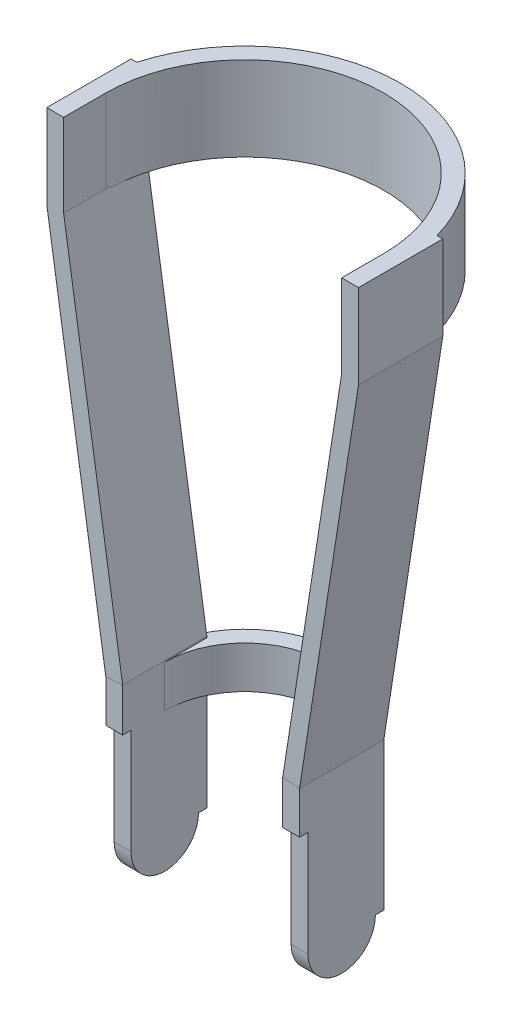
ISO-10303-21;
HEADER;
FILE_DESCRIPTION(('STEP AP214'),'2;1');
FILE_NAME('part.step','',(''),(''),'','','');
FILE_SCHEMA(('AUTOMOTIVE_DESIGN { 1 0 10303 214 1 1 1 1 }'));
ENDSEC;
DATA;
#1=APPLICATION_CONTEXT('core data for automotive mechanical design processes');
#2=APPLICATION_PROTOCOL_DEFINITION('international standard','automotive_design',2000,#1);
#3=PRODUCT_CONTEXT('',#1,'mechanical');
#4=PRODUCT('Part','Part','',(#3));
#5=PRODUCT_RELATED_PRODUCT_CATEGORY('part','',(#4));
#6=PRODUCT_DEFINITION_FORMATION('','',#4);
#7=PRODUCT_DEFINITION_CONTEXT('part definition',#1,'design');
#8=PRODUCT_DEFINITION('design','',#6,#7);
#9=PRODUCT_DEFINITION_SHAPE('','',#8);
#10=(LENGTH_UNIT() NAMED_UNIT(*) SI_UNIT(.MILLI.,.METRE.));
#11=(NAMED_UNIT(*) PLANE_ANGLE_UNIT() SI_UNIT($,.RADIAN.));
#12=(NAMED_UNIT(*) SI_UNIT($,.STERADIAN.) SOLID_ANGLE_UNIT());
#13=UNCERTAINTY_MEASURE_WITH_UNIT(LENGTH_MEASURE(1.E-05),#10,'distance_accuracy_value','');
#14=(GEOMETRIC_REPRESENTATION_CONTEXT(3) GLOBAL_UNCERTAINTY_ASSIGNED_CONTEXT((#13)) GLOBAL_UNIT_ASSIGNED_CONTEXT((#10,
#11,#12)) REPRESENTATION_CONTEXT('',''));
#15=CARTESIAN_POINT('',(0.,0.,0.));
#16=DIRECTION('',(0.,0.,1.));
#17=DIRECTION('',(1.,0.,0.));
#18=AXIS2_PLACEMENT_3D('',#15,#16,#17);
#19=CARTESIAN_POINT('',(0.,0.,0.));
#20=DIRECTION('',(0.,-1.,0.));
#21=DIRECTION('',(0.,0.,-1.));
#22=AXIS2_PLACEMENT_3D('',#19,#20,#21);
#23=PLANE('',#22);
#24=DIRECTION('',(1.,0.,0.));
#25=VECTOR('',#24,1.);
#26=CARTESIAN_POINT('',(38.,0.,-16.));
#27=LINE('',#26,#25);
#28=CARTESIAN_POINT('',(38.,0.,-16.));
#29=VERTEX_POINT('',#28);
#30=CARTESIAN_POINT('',(46.,0.,-16.));
#31=VERTEX_POINT('',#30);
#32=EDGE_CURVE('E52',#29,#31,#27,.T.);
#33=ORIENTED_EDGE('',*,*,#32,.F.);
#34=DIRECTION('',(0.,0.,1.));
#35=VECTOR('',#34,1.);
#36=CARTESIAN_POINT('',(38.,0.,20.));
#37=LINE('',#36,#35);
#38=CARTESIAN_POINT('',(38.,0.,-20.));
#39=VERTEX_POINT('',#38);
#40=EDGE_CURVE('E335',#39,#29,#37,.T.);
#41=ORIENTED_EDGE('',*,*,#40,.F.);
#42=DIRECTION('',(-1.,0.,0.));
#43=VECTOR('',#42,1.);
#44=CARTESIAN_POINT('',(38.,0.,-20.));
#45=LINE('',#44,#43);
#46=CARTESIAN_POINT('',(46.,0.,-20.));
#47=VERTEX_POINT('',#46);
#48=EDGE_CURVE('E488',#47,#39,#45,.T.);
#49=ORIENTED_EDGE('',*,*,#48,.F.);
#50=DIRECTION('',(0.,0.,-1.));
#51=VECTOR('',#50,1.);
#52=CARTESIAN_POINT('',(46.,0.,20.));
#53=LINE('',#52,#51);
#54=EDGE_CURVE('E485',#31,#47,#53,.T.);
#55=ORIENTED_EDGE('',*,*,#54,.F.);
#56=EDGE_LOOP('',(#33,#41,#49,#55));
#57=FACE_BOUND('',#56,.T.);
#58=ADVANCED_FACE('F41',(#57),#23,.T.);
#59=CARTESIAN_POINT('',(0.,290.,0.));
#60=DIRECTION('',(0.,1.,0.));
#61=DIRECTION('',(0.,0.,1.));
#62=AXIS2_PLACEMENT_3D('',#59,#60,#61);
#63=PLANE('',#62);
#64=DIRECTION('',(-1.,0.,0.));
#65=VECTOR('',#64,1.);
#66=CARTESIAN_POINT('',(66.,290.,-20.));
#67=LINE('',#66,#65);
#68=CARTESIAN_POINT('',(74.,290.,-20.));
#69=VERTEX_POINT('',#68);
#70=CARTESIAN_POINT('',(71.2460525222275,290.,-20.));
#71=VERTEX_POINT('',#70);
#72=EDGE_CURVE('E330',#69,#71,#67,.T.);
#73=ORIENTED_EDGE('',*,*,#72,.T.);
#74=CARTESIAN_POINT('',(0.,290.,0.));
#75=DIRECTION('',(0.,-1.,0.));
#76=DIRECTION('',(0.,0.,-1.));
#77=AXIS2_PLACEMENT_3D('',#74,#75,#76);
#78=CIRCLE('',#77,74.);
#79=CARTESIAN_POINT('',(-71.2460525222275,290.,-20.));
#80=VERTEX_POINT('',#79);
#81=EDGE_CURVE('E594',#80,#71,#78,.T.);
#82=ORIENTED_EDGE('',*,*,#81,.F.);
#83=DIRECTION('',(-1.,0.,0.));
#84=VECTOR('',#83,1.);
#85=CARTESIAN_POINT('',(-74.,290.,-20.));
#86=LINE('',#85,#84);
#87=CARTESIAN_POINT('',(-74.,290.,-20.));
#88=VERTEX_POINT('',#87);
#89=EDGE_CURVE('E726',#80,#88,#86,.T.);
#90=ORIENTED_EDGE('',*,*,#89,.T.);
#91=DIRECTION('',(0.,0.,-1.));
#92=VECTOR('',#91,1.);
#93=CARTESIAN_POINT('',(-74.,290.,0.));
#94=LINE('',#93,#92);
#95=CARTESIAN_POINT('',(-74.,290.,20.));
#96=VERTEX_POINT('',#95);
#97=EDGE_CURVE('E591',#96,#88,#94,.T.);
#98=ORIENTED_EDGE('',*,*,#97,.F.);
#99=DIRECTION('',(-1.,0.,0.));
#100=VECTOR('',#99,1.);
#101=CARTESIAN_POINT('',(-74.,290.,20.));
#102=LINE('',#101,#100);
#103=CARTESIAN_POINT('',(-66.,290.,20.));
#104=VERTEX_POINT('',#103);
#105=EDGE_CURVE('E576',#104,#96,#102,.T.);
#106=ORIENTED_EDGE('',*,*,#105,.F.);
#107=DIRECTION('',(0.,0.,1.));
#108=VECTOR('',#107,1.);
#109=CARTESIAN_POINT('',(-66.,290.,0.));
#110=LINE('',#109,#108);
#111=CARTESIAN_POINT('',(-66.,290.,0.));
#112=VERTEX_POINT('',#111);
#113=EDGE_CURVE('E560',#112,#104,#110,.T.);
#114=ORIENTED_EDGE('',*,*,#113,.F.);
#115=CARTESIAN_POINT('',(0.,290.,0.));
#116=DIRECTION('',(0.,1.,0.));
#117=DIRECTION('',(0.,0.,-1.));
#118=AXIS2_PLACEMENT_3D('',#115,#116,#117);
#119=CIRCLE('',#118,66.);
#120=CARTESIAN_POINT('',(66.,290.,0.));
#121=VERTEX_POINT('',#120);
#122=EDGE_CURVE('E551',#121,#112,#119,.T.);
#123=ORIENTED_EDGE('',*,*,#122,.F.);
#124=DIRECTION('',(0.,0.,-1.));
#125=VECTOR('',#124,1.);
#126=CARTESIAN_POINT('',(66.,290.,0.));
#127=LINE('',#126,#125);
#128=CARTESIAN_POINT('',(66.,290.,20.));
#129=VERTEX_POINT('',#128);
#130=EDGE_CURVE('E536',#129,#121,#127,.T.);
#131=ORIENTED_EDGE('',*,*,#130,.F.);
#132=DIRECTION('',(-1.,0.,0.));
#133=VECTOR('',#132,1.);
#134=CARTESIAN_POINT('',(74.,290.,20.));
#135=LINE('',#134,#133);
#136=CARTESIAN_POINT('',(74.,290.,20.));
#137=VERTEX_POINT('',#136);
#138=EDGE_CURVE('E535',#137,#129,#135,.T.);
#139=ORIENTED_EDGE('',*,*,#138,.F.);
#140=DIRECTION('',(0.,0.,1.));
#141=VECTOR('',#140,1.);
#142=CARTESIAN_POINT('',(74.,290.,0.));
#143=LINE('',#142,#141);
#144=EDGE_CURVE('E606',#69,#137,#143,.T.);
#145=ORIENTED_EDGE('',*,*,#144,.F.);
#146=EDGE_LOOP('',(#73,#82,#90,#98,#106,#114,#123,#131,#139,#145));
#147=FACE_BOUND('',#146,.T.);
#148=ADVANCED_FACE('F43',(#147),#63,.T.);
#149=CARTESIAN_POINT('',(0.,250.,0.));
#150=DIRECTION('',(0.,1.,0.));
#151=DIRECTION('',(0.,0.,1.));
#152=AXIS2_PLACEMENT_3D('',#149,#150,#151);
#153=PLANE('',#152);
#154=CARTESIAN_POINT('',(0.,250.,0.));
#155=DIRECTION('',(0.,-1.,0.));
#156=DIRECTION('',(0.,0.,-1.));
#157=AXIS2_PLACEMENT_3D('',#154,#155,#156);
#158=CIRCLE('',#157,74.);
#159=CARTESIAN_POINT('',(-71.2460525222275,250.,-20.));
#160=VERTEX_POINT('',#159);
#161=CARTESIAN_POINT('',(71.2460525222275,250.,-20.));
#162=VERTEX_POINT('',#161);
#163=EDGE_CURVE('E598',#160,#162,#158,.T.);
#164=ORIENTED_EDGE('',*,*,#163,.T.);
#165=DIRECTION('',(-1.,0.,0.));
#166=VECTOR('',#165,1.);
#167=CARTESIAN_POINT('',(0.,250.,-20.));
#168=LINE('',#167,#166);
#169=CARTESIAN_POINT('',(65.9037884183213,250.,-20.));
#170=VERTEX_POINT('',#169);
#171=EDGE_CURVE('E353',#162,#170,#168,.T.);
#172=ORIENTED_EDGE('',*,*,#171,.T.);
#173=DIRECTION('',(0.,0.,1.));
#174=VECTOR('',#173,1.);
#175=CARTESIAN_POINT('',(65.9037884183213,250.,0.));
#176=LINE('',#175,#174);
#177=CARTESIAN_POINT('',(65.9037884183213,250.,-3.56239696175823));
#178=VERTEX_POINT('',#177);
#179=EDGE_CURVE('E362',#170,#178,#176,.T.);
#180=ORIENTED_EDGE('',*,*,#179,.T.);
#181=CARTESIAN_POINT('',(0.,250.,0.));
#182=DIRECTION('',(0.,1.,0.));
#183=DIRECTION('',(0.,0.,-1.));
#184=AXIS2_PLACEMENT_3D('',#181,#182,#183);
#185=CIRCLE('',#184,66.);
#186=CARTESIAN_POINT('',(-65.9037884183213,250.,-3.56239696175823));
#187=VERTEX_POINT('',#186);
#188=EDGE_CURVE('E508',#178,#187,#185,.T.);
#189=ORIENTED_EDGE('',*,*,#188,.T.);
#190=DIRECTION('',(0.,0.,-1.));
#191=VECTOR('',#190,1.);
#192=CARTESIAN_POINT('',(-65.9037884183213,250.,0.));
#193=LINE('',#192,#191);
#194=CARTESIAN_POINT('',(-65.9037884183213,250.,-20.));
#195=VERTEX_POINT('',#194);
#196=EDGE_CURVE('E649',#187,#195,#193,.T.);
#197=ORIENTED_EDGE('',*,*,#196,.T.);
#198=DIRECTION('',(-1.,0.,0.));
#199=VECTOR('',#198,1.);
#200=CARTESIAN_POINT('',(0.,250.,-20.));
#201=LINE('',#200,#199);
#202=EDGE_CURVE('E651',#195,#160,#201,.T.);
#203=ORIENTED_EDGE('',*,*,#202,.T.);
#204=EDGE_LOOP('',(#164,#172,#180,#189,#197,#203));
#205=FACE_BOUND('',#204,.T.);
#206=ADVANCED_FACE('F791',(#205),#153,.F.);
#207=CARTESIAN_POINT('',(-74.,250.,0.));
#208=DIRECTION('',(1.,0.,0.));
#209=DIRECTION('',(0.,0.,-1.));
#210=AXIS2_PLACEMENT_3D('',#207,#208,#209);
#211=PLANE('',#210);
#212=ORIENTED_EDGE('',*,*,#97,.T.);
#213=DIRECTION('',(0.,1.,0.));
#214=VECTOR('',#213,1.);
#215=CARTESIAN_POINT('',(-74.,250.,-20.));
#216=LINE('',#215,#214);
#217=CARTESIAN_POINT('',(-74.,250.,-20.));
#218=VERTEX_POINT('',#217);
#219=EDGE_CURVE('E730',#218,#88,#216,.T.);
#220=ORIENTED_EDGE('',*,*,#219,.F.);
#221=DIRECTION('',(0.,0.,-1.));
#222=VECTOR('',#221,1.);
#223=CARTESIAN_POINT('',(-74.,250.,0.));
#224=LINE('',#223,#222);
#225=CARTESIAN_POINT('',(-74.,250.,20.));
#226=VERTEX_POINT('',#225);
#227=EDGE_CURVE('E584',#226,#218,#224,.T.);
#228=ORIENTED_EDGE('',*,*,#227,.F.);
#229=DIRECTION('',(0.,1.,0.));
#230=VECTOR('',#229,1.);
#231=CARTESIAN_POINT('',(-74.,250.,20.));
#232=LINE('',#231,#230);
#233=EDGE_CURVE('E587',#226,#96,#232,.T.);
#234=ORIENTED_EDGE('',*,*,#233,.T.);
#235=EDGE_LOOP('',(#212,#220,#228,#234));
#236=FACE_BOUND('',#235,.T.);
#237=ADVANCED_FACE('F807',(#236),#211,.F.);
#238=CARTESIAN_POINT('',(-74.,250.,20.));
#239=DIRECTION('',(0.,0.,-1.));
#240=DIRECTION('',(-1.,0.,0.));
#241=AXIS2_PLACEMENT_3D('',#238,#239,#240);
#242=PLANE('',#241);
#243=DIRECTION('',(-0.153707006281871,0.988116468954882,0.));
#244=VECTOR('',#243,1.);
#245=CARTESIAN_POINT('',(-37.9751224745357,70.4585760756643,20.));
#246=LINE('',#245,#244);
#247=CARTESIAN_POINT('',(-38.,70.6185030250775,20.));
#248=VERTEX_POINT('',#247);
#249=CARTESIAN_POINT('',(-66.,250.618503025078,20.));
#250=VERTEX_POINT('',#249);
#251=EDGE_CURVE('E716',#248,#250,#246,.T.);
#252=ORIENTED_EDGE('',*,*,#251,.T.);
#253=DIRECTION('',(0.,1.,0.));
#254=VECTOR('',#253,1.);
#255=CARTESIAN_POINT('',(-66.,250.,20.));
#256=LINE('',#255,#254);
#257=EDGE_CURVE('E572',#250,#104,#256,.T.);
#258=ORIENTED_EDGE('',*,*,#257,.T.);
#259=ORIENTED_EDGE('',*,*,#105,.T.);
#260=ORIENTED_EDGE('',*,*,#233,.F.);
#261=DIRECTION('',(-0.153707006281871,0.988116468954882,0.));
#262=VECTOR('',#261,1.);
#263=CARTESIAN_POINT('',(-45.8800542261748,69.2289200254093,20.));
#264=LINE('',#263,#262);
#265=CARTESIAN_POINT('',(-46.,70.,20.));
#266=VERTEX_POINT('',#265);
#267=EDGE_CURVE('E577',#266,#226,#264,.T.);
#268=ORIENTED_EDGE('',*,*,#267,.F.);
#269=DIRECTION('',(-0.997024691006919,-0.0770828484330906,0.));
#270=VECTOR('',#269,1.);
#271=CARTESIAN_POINT('',(-47.5370700628187,69.8811646895488,20.));
#272=LINE('',#271,#270);
#273=EDGE_CURVE('E696',#248,#266,#272,.T.);
#274=ORIENTED_EDGE('',*,*,#273,.F.);
#275=EDGE_LOOP('',(#252,#258,#259,#260,#268,#274));
#276=FACE_BOUND('',#275,.T.);
#277=ADVANCED_FACE('F811',(#276),#242,.F.);
#278=CARTESIAN_POINT('',(-66.,250.,0.));
#279=DIRECTION('',(-1.,0.,0.));
#280=DIRECTION('',(0.,0.,1.));
#281=AXIS2_PLACEMENT_3D('',#278,#279,#280);
#282=PLANE('',#281);
#283=ORIENTED_EDGE('',*,*,#257,.F.);
#284=DIRECTION('',(0.,0.,1.));
#285=VECTOR('',#284,1.);
#286=CARTESIAN_POINT('',(-66.,250.618503025078,20.));
#287=LINE('',#286,#285);
#288=CARTESIAN_POINT('',(-66.,250.618503025078,0.));
#289=VERTEX_POINT('',#288);
#290=EDGE_CURVE('E720',#289,#250,#287,.T.);
#291=ORIENTED_EDGE('',*,*,#290,.F.);
#292=DIRECTION('',(0.,1.,0.));
#293=VECTOR('',#292,1.);
#294=CARTESIAN_POINT('',(-66.,250.,0.));
#295=LINE('',#294,#293);
#296=EDGE_CURVE('E555',#289,#112,#295,.T.);
#297=ORIENTED_EDGE('',*,*,#296,.T.);
#298=ORIENTED_EDGE('',*,*,#113,.T.);
#299=EDGE_LOOP('',(#283,#291,#297,#298));
#300=FACE_BOUND('',#299,.T.);
#301=ADVANCED_FACE('F1027',(#300),#282,.F.);
#302=CARTESIAN_POINT('',(0.,250.,0.));
#303=DIRECTION('',(0.,1.,0.));
#304=DIRECTION('',(0.,0.,1.));
#305=AXIS2_PLACEMENT_3D('',#302,#303,#304);
#306=CYLINDRICAL_SURFACE('',#305,66.);
#307=ORIENTED_EDGE('',*,*,#188,.F.);
#308=CARTESIAN_POINT('',(0.,-173.667211260637,0.));
#309=DIRECTION('',(-0.988116468954882,0.153707006281871,0.));
#310=DIRECTION('',(0.153707006281871,0.988116468954882,0.));
#311=AXIS2_PLACEMENT_3D('',#308,#309,#310);
#312=ELLIPSE('',#311,429.388364242604,66.);
#313=CARTESIAN_POINT('',(66.,250.618503025078,0.));
#314=VERTEX_POINT('',#313);
#315=EDGE_CURVE('E358',#178,#314,#312,.F.);
#316=ORIENTED_EDGE('',*,*,#315,.T.);
#317=DIRECTION('',(0.,1.,0.));
#318=VECTOR('',#317,1.);
#319=CARTESIAN_POINT('',(66.,250.,0.));
#320=LINE('',#319,#318);
#321=EDGE_CURVE('E537',#314,#121,#320,.T.);
#322=ORIENTED_EDGE('',*,*,#321,.T.);
#323=ORIENTED_EDGE('',*,*,#122,.T.);
#324=ORIENTED_EDGE('',*,*,#296,.F.);
#325=CARTESIAN_POINT('',(0.,-173.667211260637,0.));
#326=DIRECTION('',(0.988116468954882,0.153707006281871,0.));
#327=DIRECTION('',(-0.153707006281871,0.988116468954882,0.));
#328=AXIS2_PLACEMENT_3D('',#325,#326,#327);
#329=ELLIPSE('',#328,429.388364242604,66.);
#330=EDGE_CURVE('E568',#289,#187,#329,.F.);
#331=ORIENTED_EDGE('',*,*,#330,.T.);
#332=EDGE_LOOP('',(#307,#316,#322,#323,#324,#331));
#333=FACE_BOUND('',#332,.T.);
#334=ADVANCED_FACE('F636',(#333),#306,.F.);
#335=CARTESIAN_POINT('',(66.,250.,0.));
#336=DIRECTION('',(1.,0.,0.));
#337=DIRECTION('',(0.,0.,-1.));
#338=AXIS2_PLACEMENT_3D('',#335,#336,#337);
#339=PLANE('',#338);
#340=ORIENTED_EDGE('',*,*,#321,.F.);
#341=DIRECTION('',(0.,0.,-1.));
#342=VECTOR('',#341,1.);
#343=CARTESIAN_POINT('',(66.,250.618503025078,20.));
#344=LINE('',#343,#342);
#345=CARTESIAN_POINT('',(66.,250.618503025078,20.));
#346=VERTEX_POINT('',#345);
#347=EDGE_CURVE('E469',#346,#314,#344,.T.);
#348=ORIENTED_EDGE('',*,*,#347,.F.);
#349=DIRECTION('',(0.,1.,0.));
#350=VECTOR('',#349,1.);
#351=CARTESIAN_POINT('',(66.,250.,20.));
#352=LINE('',#351,#350);
#353=EDGE_CURVE('E532',#346,#129,#352,.T.);
#354=ORIENTED_EDGE('',*,*,#353,.T.);
#355=ORIENTED_EDGE('',*,*,#130,.T.);
#356=EDGE_LOOP('',(#340,#348,#354,#355));
#357=FACE_BOUND('',#356,.T.);
#358=ADVANCED_FACE('F630',(#357),#339,.F.);
#359=CARTESIAN_POINT('',(74.,250.,20.));
#360=DIRECTION('',(0.,0.,-1.));
#361=DIRECTION('',(-1.,0.,0.));
#362=AXIS2_PLACEMENT_3D('',#359,#360,#361);
#363=PLANE('',#362);
#364=DIRECTION('',(0.153707006281871,0.988116468954882,0.));
#365=VECTOR('',#364,1.);
#366=CARTESIAN_POINT('',(45.8800542261748,69.2289200254093,20.));
#367=LINE('',#366,#365);
#368=CARTESIAN_POINT('',(46.,70.,20.));
#369=VERTEX_POINT('',#368);
#370=CARTESIAN_POINT('',(74.,250.,20.));
#371=VERTEX_POINT('',#370);
#372=EDGE_CURVE('E432',#369,#371,#367,.T.);
#373=ORIENTED_EDGE('',*,*,#372,.T.);
#374=DIRECTION('',(0.,1.,0.));
#375=VECTOR('',#374,1.);
#376=CARTESIAN_POINT('',(74.,250.,20.));
#377=LINE('',#376,#375);
#378=EDGE_CURVE('E609',#371,#137,#377,.T.);
#379=ORIENTED_EDGE('',*,*,#378,.T.);
#380=ORIENTED_EDGE('',*,*,#138,.T.);
#381=ORIENTED_EDGE('',*,*,#353,.F.);
#382=DIRECTION('',(0.153707006281871,0.988116468954882,0.));
#383=VECTOR('',#382,1.);
#384=CARTESIAN_POINT('',(37.9751224745357,70.4585760756643,20.));
#385=LINE('',#384,#383);
#386=CARTESIAN_POINT('',(38.,70.6185030250775,20.));
#387=VERTEX_POINT('',#386);
#388=EDGE_CURVE('E460',#387,#346,#385,.T.);
#389=ORIENTED_EDGE('',*,*,#388,.F.);
#390=DIRECTION('',(-0.997024691006919,0.0770828484330906,0.));
#391=VECTOR('',#390,1.);
#392=CARTESIAN_POINT('',(39.5846041869992,70.4959927146763,20.));
#393=LINE('',#392,#391);
#394=EDGE_CURVE('E466',#369,#387,#393,.T.);
#395=ORIENTED_EDGE('',*,*,#394,.F.);
#396=EDGE_LOOP('',(#373,#379,#380,#381,#389,#395));
#397=FACE_BOUND('',#396,.T.);
#398=ADVANCED_FACE('F622',(#397),#363,.F.);
#399=CARTESIAN_POINT('',(74.,250.,0.));
#400=DIRECTION('',(-1.,0.,0.));
#401=DIRECTION('',(0.,0.,1.));
#402=AXIS2_PLACEMENT_3D('',#399,#400,#401);
#403=PLANE('',#402);
#404=ORIENTED_EDGE('',*,*,#144,.T.);
#405=ORIENTED_EDGE('',*,*,#378,.F.);
#406=DIRECTION('',(0.,0.,1.));
#407=VECTOR('',#406,1.);
#408=CARTESIAN_POINT('',(74.,250.,0.));
#409=LINE('',#408,#407);
#410=CARTESIAN_POINT('',(74.,250.,-20.));
#411=VERTEX_POINT('',#410);
#412=EDGE_CURVE('E599',#411,#371,#409,.T.);
#413=ORIENTED_EDGE('',*,*,#412,.F.);
#414=DIRECTION('',(0.,1.,0.));
#415=VECTOR('',#414,1.);
#416=CARTESIAN_POINT('',(74.,250.,-20.));
#417=LINE('',#416,#415);
#418=EDGE_CURVE('E472',#411,#69,#417,.T.);
#419=ORIENTED_EDGE('',*,*,#418,.T.);
#420=EDGE_LOOP('',(#404,#405,#413,#419));
#421=FACE_BOUND('',#420,.T.);
#422=ADVANCED_FACE('F767',(#421),#403,.F.);
#423=CARTESIAN_POINT('',(0.,250.,0.));
#424=DIRECTION('',(0.,1.,0.));
#425=DIRECTION('',(0.,0.,1.));
#426=AXIS2_PLACEMENT_3D('',#423,#424,#425);
#427=CYLINDRICAL_SURFACE('',#426,74.);
#428=ORIENTED_EDGE('',*,*,#81,.T.);
#429=DIRECTION('',(0.,1.,0.));
#430=VECTOR('',#429,1.);
#431=CARTESIAN_POINT('',(71.2460525222275,250.,-20.));
#432=LINE('',#431,#430);
#433=CARTESIAN_POINT('',(71.2460525222275,250.212915605738,-20.));
#434=VERTEX_POINT('',#433);
#435=EDGE_CURVE('E519',#71,#434,#432,.F.);
#436=ORIENTED_EDGE('',*,*,#435,.T.);
#437=DIRECTION('',(0.,1.,0.));
#438=VECTOR('',#437,1.);
#439=CARTESIAN_POINT('',(71.2460525222275,250.,-20.));
#440=LINE('',#439,#438);
#441=EDGE_CURVE('E525',#434,#162,#440,.F.);
#442=ORIENTED_EDGE('',*,*,#441,.T.);
#443=ORIENTED_EDGE('',*,*,#163,.F.);
#444=DIRECTION('',(0.,1.,0.));
#445=VECTOR('',#444,1.);
#446=CARTESIAN_POINT('',(-71.2460525222275,250.,-20.));
#447=LINE('',#446,#445);
#448=CARTESIAN_POINT('',(-71.2460525222275,250.212915605738,-20.));
#449=VERTEX_POINT('',#448);
#450=EDGE_CURVE('E818',#160,#449,#447,.T.);
#451=ORIENTED_EDGE('',*,*,#450,.T.);
#452=DIRECTION('',(0.,1.,0.));
#453=VECTOR('',#452,1.);
#454=CARTESIAN_POINT('',(-71.2460525222275,250.,-20.));
#455=LINE('',#454,#453);
#456=EDGE_CURVE('E566',#449,#80,#455,.T.);
#457=ORIENTED_EDGE('',*,*,#456,.T.);
#458=EDGE_LOOP('',(#428,#436,#442,#443,#451,#457));
#459=FACE_BOUND('',#458,.T.);
#460=ADVANCED_FACE('F785',(#459),#427,.T.);
#461=CARTESIAN_POINT('',(-37.9751224745357,70.4585760756643,20.));
#462=DIRECTION('',(0.988116468954882,0.153707006281871,0.));
#463=DIRECTION('',(-0.153707006281871,0.988116468954882,0.));
#464=AXIS2_PLACEMENT_3D('',#461,#462,#463);
#465=PLANE('',#464);
#466=ORIENTED_EDGE('',*,*,#196,.F.);
#467=ORIENTED_EDGE('',*,*,#330,.F.);
#468=ORIENTED_EDGE('',*,*,#290,.T.);
#469=ORIENTED_EDGE('',*,*,#251,.F.);
#470=DIRECTION('',(0.,0.,1.));
#471=VECTOR('',#470,1.);
#472=CARTESIAN_POINT('',(-38.,70.6185030250775,20.));
#473=LINE('',#472,#471);
#474=CARTESIAN_POINT('',(-38.,70.6185030250775,-20.));
#475=VERTEX_POINT('',#474);
#476=EDGE_CURVE('E692',#475,#248,#473,.T.);
#477=ORIENTED_EDGE('',*,*,#476,.F.);
#478=DIRECTION('',(-0.153707006281871,0.988116468954882,0.));
#479=VECTOR('',#478,1.);
#480=CARTESIAN_POINT('',(-37.9751224745357,70.4585760756643,-20.));
#481=LINE('',#480,#479);
#482=EDGE_CURVE('E712',#475,#195,#481,.T.);
#483=ORIENTED_EDGE('',*,*,#482,.T.);
#484=EDGE_LOOP('',(#466,#467,#468,#469,#477,#483));
#485=FACE_BOUND('',#484,.T.);
#486=ADVANCED_FACE('F792',(#485),#465,.T.);
#487=CARTESIAN_POINT('',(-74.,250.,-20.));
#488=DIRECTION('',(0.,0.,-1.));
#489=DIRECTION('',(-1.,0.,0.));
#490=AXIS2_PLACEMENT_3D('',#487,#488,#489);
#491=PLANE('',#490);
#492=ORIENTED_EDGE('',*,*,#456,.F.);
#493=DIRECTION('',(0.997024691006918,0.0770828484330906,0.));
#494=VECTOR('',#493,1.);
#495=CARTESIAN_POINT('',(-59.9400271130874,251.087016970383,-20.));
#496=LINE('',#495,#494);
#497=EDGE_CURVE('E723',#218,#449,#496,.T.);
#498=ORIENTED_EDGE('',*,*,#497,.F.);
#499=ORIENTED_EDGE('',*,*,#219,.T.);
#500=ORIENTED_EDGE('',*,*,#89,.F.);
#501=EDGE_LOOP('',(#492,#498,#499,#500));
#502=FACE_BOUND('',#501,.T.);
#503=ADVANCED_FACE('F801',(#502),#491,.T.);
#504=CARTESIAN_POINT('',(-45.8800542261748,69.2289200254093,-20.));
#505=DIRECTION('',(0.,0.,-1.));
#506=DIRECTION('',(-1.,0.,0.));
#507=AXIS2_PLACEMENT_3D('',#504,#505,#506);
#508=PLANE('',#507);
#509=ORIENTED_EDGE('',*,*,#202,.F.);
#510=ORIENTED_EDGE('',*,*,#482,.F.);
#511=DIRECTION('',(0.997024691006919,0.0770828484330906,0.));
#512=VECTOR('',#511,1.);
#513=CARTESIAN_POINT('',(-47.5370700628187,69.8811646895488,-20.));
#514=LINE('',#513,#512);
#515=CARTESIAN_POINT('',(-46.,70.,-20.));
#516=VERTEX_POINT('',#515);
#517=EDGE_CURVE('E703',#516,#475,#514,.T.);
#518=ORIENTED_EDGE('',*,*,#517,.F.);
#519=DIRECTION('',(-0.153707006281871,0.988116468954882,0.));
#520=VECTOR('',#519,1.);
#521=CARTESIAN_POINT('',(-45.8800542261748,69.2289200254093,-20.));
#522=LINE('',#521,#520);
#523=EDGE_CURVE('E709',#516,#218,#522,.T.);
#524=ORIENTED_EDGE('',*,*,#523,.T.);
#525=ORIENTED_EDGE('',*,*,#497,.T.);
#526=ORIENTED_EDGE('',*,*,#450,.F.);
#527=EDGE_LOOP('',(#509,#510,#518,#524,#525,#526));
#528=FACE_BOUND('',#527,.T.);
#529=ADVANCED_FACE('F833',(#528),#508,.T.);
#530=CARTESIAN_POINT('',(0.,0.,0.));
#531=DIRECTION('',(0.,-1.,0.));
#532=DIRECTION('',(0.,0.,-1.));
#533=AXIS2_PLACEMENT_3D('',#530,#531,#532);
#534=PLANE('',#533);
#535=DIRECTION('',(-1.,0.,0.));
#536=VECTOR('',#535,1.);
#537=CARTESIAN_POINT('',(-38.,0.,-16.));
#538=LINE('',#537,#536);
#539=CARTESIAN_POINT('',(-46.,0.,-16.));
#540=VERTEX_POINT('',#539);
#541=CARTESIAN_POINT('',(-38.,0.,-16.));
#542=VERTEX_POINT('',#541);
#543=EDGE_CURVE('E319',#540,#542,#538,.F.);
#544=ORIENTED_EDGE('',*,*,#543,.F.);
#545=DIRECTION('',(0.,0.,1.));
#546=VECTOR('',#545,1.);
#547=CARTESIAN_POINT('',(-46.,0.,20.));
#548=LINE('',#547,#546);
#549=CARTESIAN_POINT('',(-46.,0.,-20.));
#550=VERTEX_POINT('',#549);
#551=EDGE_CURVE('E662',#550,#540,#548,.T.);
#552=ORIENTED_EDGE('',*,*,#551,.F.);
#553=DIRECTION('',(-1.,0.,0.));
#554=VECTOR('',#553,1.);
#555=CARTESIAN_POINT('',(-46.,0.,-20.));
#556=LINE('',#555,#554);
#557=CARTESIAN_POINT('',(-38.,0.,-20.));
#558=VERTEX_POINT('',#557);
#559=EDGE_CURVE('E658',#558,#550,#556,.T.);
#560=ORIENTED_EDGE('',*,*,#559,.F.);
#561=DIRECTION('',(0.,0.,-1.));
#562=VECTOR('',#561,1.);
#563=CARTESIAN_POINT('',(-38.,0.,20.));
#564=LINE('',#563,#562);
#565=EDGE_CURVE('E655',#542,#558,#564,.T.);
#566=ORIENTED_EDGE('',*,*,#565,.F.);
#567=EDGE_LOOP('',(#544,#552,#560,#566));
#568=FACE_BOUND('',#567,.T.);
#569=ADVANCED_FACE('F855',(#568),#534,.T.);
#570=CARTESIAN_POINT('',(-45.8800542261748,69.2289200254093,20.));
#571=DIRECTION('',(-0.988116468954882,-0.153707006281871,0.));
#572=DIRECTION('',(0.153707006281871,-0.988116468954882,0.));
#573=AXIS2_PLACEMENT_3D('',#570,#571,#572);
#574=PLANE('',#573);
#575=DIRECTION('',(0.,0.,-1.));
#576=VECTOR('',#575,1.);
#577=CARTESIAN_POINT('',(-46.,70.,20.));
#578=LINE('',#577,#576);
#579=EDGE_CURVE('E700',#266,#516,#578,.T.);
#580=ORIENTED_EDGE('',*,*,#579,.F.);
#581=ORIENTED_EDGE('',*,*,#267,.T.);
#582=ORIENTED_EDGE('',*,*,#227,.T.);
#583=ORIENTED_EDGE('',*,*,#523,.F.);
#584=EDGE_LOOP('',(#580,#581,#582,#583));
#585=FACE_BOUND('',#584,.T.);
#586=ADVANCED_FACE('F837',(#585),#574,.T.);
#587=CARTESIAN_POINT('',(-38.,0.,20.));
#588=DIRECTION('',(1.,0.,0.));
#589=DIRECTION('',(0.,1.,0.));
#590=AXIS2_PLACEMENT_3D('',#587,#588,#589);
#591=PLANE('',#590);
#592=DIRECTION('',(0.,1.,0.));
#593=VECTOR('',#592,1.);
#594=CARTESIAN_POINT('',(-38.,0.,16.));
#595=LINE('',#594,#593);
#596=CARTESIAN_POINT('',(-38.,0.,16.));
#597=VERTEX_POINT('',#596);
#598=CARTESIAN_POINT('',(-38.,50.,16.));
#599=VERTEX_POINT('',#598);
#600=EDGE_CURVE('E285',#597,#599,#595,.T.);
#601=ORIENTED_EDGE('',*,*,#600,.F.);
#602=CARTESIAN_POINT('',(-38.,0.,0.));
#603=DIRECTION('',(-1.,0.,0.));
#604=DIRECTION('',(0.,-1.,0.));
#605=AXIS2_PLACEMENT_3D('',#602,#603,#604);
#606=CIRCLE('',#605,16.);
#607=EDGE_CURVE('E315',#542,#597,#606,.T.);
#608=ORIENTED_EDGE('',*,*,#607,.F.);
#609=ORIENTED_EDGE('',*,*,#565,.T.);
#610=DIRECTION('',(0.,1.,0.));
#611=VECTOR('',#610,1.);
#612=CARTESIAN_POINT('',(-38.,0.,-20.));
#613=LINE('',#612,#611);
#614=CARTESIAN_POINT('',(-38.,50.,-20.));
#615=VERTEX_POINT('',#614);
#616=EDGE_CURVE('E667',#558,#615,#613,.T.);
#617=ORIENTED_EDGE('',*,*,#616,.T.);
#618=DIRECTION('',(0.,0.,1.));
#619=VECTOR('',#618,1.);
#620=CARTESIAN_POINT('',(-38.,50.,20.));
#621=LINE('',#620,#619);
#622=CARTESIAN_POINT('',(-38.,50.,0.));
#623=VERTEX_POINT('',#622);
#624=EDGE_CURVE('E374',#615,#623,#621,.T.);
#625=ORIENTED_EDGE('',*,*,#624,.T.);
#626=DIRECTION('',(0.,1.,0.));
#627=VECTOR('',#626,1.);
#628=CARTESIAN_POINT('',(-38.,50.,0.));
#629=LINE('',#628,#627);
#630=CARTESIAN_POINT('',(-38.,70.,0.));
#631=VERTEX_POINT('',#630);
#632=EDGE_CURVE('E387',#623,#631,#629,.T.);
#633=ORIENTED_EDGE('',*,*,#632,.T.);
#634=DIRECTION('',(0.,0.,1.));
#635=VECTOR('',#634,1.);
#636=CARTESIAN_POINT('',(-38.,70.,20.));
#637=LINE('',#636,#635);
#638=CARTESIAN_POINT('',(-38.,70.,-20.));
#639=VERTEX_POINT('',#638);
#640=EDGE_CURVE('E738',#639,#631,#637,.T.);
#641=ORIENTED_EDGE('',*,*,#640,.F.);
#642=DIRECTION('',(0.,1.,0.));
#643=VECTOR('',#642,1.);
#644=CARTESIAN_POINT('',(-38.,50.,-20.));
#645=LINE('',#644,#643);
#646=EDGE_CURVE('E685',#639,#475,#645,.T.);
#647=ORIENTED_EDGE('',*,*,#646,.T.);
#648=ORIENTED_EDGE('',*,*,#476,.T.);
#649=DIRECTION('',(0.,1.,0.));
#650=VECTOR('',#649,1.);
#651=CARTESIAN_POINT('',(-38.,0.,20.));
#652=LINE('',#651,#650);
#653=CARTESIAN_POINT('',(-38.,50.,20.));
#654=VERTEX_POINT('',#653);
#655=EDGE_CURVE('E45',#654,#248,#652,.T.);
#656=ORIENTED_EDGE('',*,*,#655,.F.);
#657=DIRECTION('',(0.,0.,1.));
#658=VECTOR('',#657,1.);
#659=CARTESIAN_POINT('',(-38.,50.,20.));
#660=LINE('',#659,#658);
#661=EDGE_CURVE('E312',#599,#654,#660,.T.);
#662=ORIENTED_EDGE('',*,*,#661,.F.);
#663=EDGE_LOOP('',(#601,#608,#609,#617,#625,#633,#641,#647,#648,#656,#662));
#664=FACE_BOUND('',#663,.T.);
#665=ADVANCED_FACE('F859',(#664),#591,.T.);
#666=CARTESIAN_POINT('',(-46.,0.,-20.));
#667=DIRECTION('',(0.,0.,-1.));
#668=DIRECTION('',(-1.,0.,0.));
#669=AXIS2_PLACEMENT_3D('',#666,#667,#668);
#670=PLANE('',#669);
#671=DIRECTION('',(0.,1.,0.));
#672=VECTOR('',#671,1.);
#673=CARTESIAN_POINT('',(-46.,0.,-20.));
#674=LINE('',#673,#672);
#675=CARTESIAN_POINT('',(-46.,50.,-20.));
#676=VERTEX_POINT('',#675);
#677=EDGE_CURVE('E677',#550,#676,#674,.T.);
#678=ORIENTED_EDGE('',*,*,#677,.T.);
#679=DIRECTION('',(-1.,0.,0.));
#680=VECTOR('',#679,1.);
#681=CARTESIAN_POINT('',(-46.,50.,-20.));
#682=LINE('',#681,#680);
#683=CARTESIAN_POINT('',(-41.424630354416,50.,-20.));
#684=VERTEX_POINT('',#683);
#685=EDGE_CURVE('E674',#684,#676,#682,.T.);
#686=ORIENTED_EDGE('',*,*,#685,.F.);
#687=EDGE_CURVE('E670',#615,#684,#682,.T.);
#688=ORIENTED_EDGE('',*,*,#687,.F.);
#689=ORIENTED_EDGE('',*,*,#616,.F.);
#690=ORIENTED_EDGE('',*,*,#559,.T.);
#691=EDGE_LOOP('',(#678,#686,#688,#689,#690));
#692=FACE_BOUND('',#691,.T.);
#693=ADVANCED_FACE('F849',(#692),#670,.T.);
#694=CARTESIAN_POINT('',(-46.,0.,20.));
#695=DIRECTION('',(-1.,0.,0.));
#696=DIRECTION('',(0.,-1.,0.));
#697=AXIS2_PLACEMENT_3D('',#694,#695,#696);
#698=PLANE('',#697);
#699=ORIENTED_EDGE('',*,*,#677,.F.);
#700=ORIENTED_EDGE('',*,*,#551,.T.);
#701=CARTESIAN_POINT('',(-46.,0.,0.));
#702=DIRECTION('',(-1.,0.,0.));
#703=DIRECTION('',(0.,-1.,0.));
#704=AXIS2_PLACEMENT_3D('',#701,#702,#703);
#705=CIRCLE('',#704,16.);
#706=CARTESIAN_POINT('',(-46.,0.,16.));
#707=VERTEX_POINT('',#706);
#708=EDGE_CURVE('E291',#540,#707,#705,.T.);
#709=ORIENTED_EDGE('',*,*,#708,.T.);
#710=DIRECTION('',(0.,-1.,0.));
#711=VECTOR('',#710,1.);
#712=CARTESIAN_POINT('',(-46.,0.,16.));
#713=LINE('',#712,#711);
#714=CARTESIAN_POINT('',(-46.,50.,16.));
#715=VERTEX_POINT('',#714);
#716=EDGE_CURVE('E60',#715,#707,#713,.T.);
#717=ORIENTED_EDGE('',*,*,#716,.F.);
#718=DIRECTION('',(0.,0.,-1.));
#719=VECTOR('',#718,1.);
#720=CARTESIAN_POINT('',(-46.,50.,16.));
#721=LINE('',#720,#719);
#722=CARTESIAN_POINT('',(-46.,50.,20.));
#723=VERTEX_POINT('',#722);
#724=EDGE_CURVE('E273',#723,#715,#721,.T.);
#725=ORIENTED_EDGE('',*,*,#724,.F.);
#726=DIRECTION('',(0.,1.,0.));
#727=VECTOR('',#726,1.);
#728=CARTESIAN_POINT('',(-46.,0.,20.));
#729=LINE('',#728,#727);
#730=EDGE_CURVE('E683',#723,#266,#729,.T.);
#731=ORIENTED_EDGE('',*,*,#730,.T.);
#732=ORIENTED_EDGE('',*,*,#579,.T.);
#733=DIRECTION('',(0.,1.,0.));
#734=VECTOR('',#733,1.);
#735=CARTESIAN_POINT('',(-46.,50.,-20.));
#736=LINE('',#735,#734);
#737=EDGE_CURVE('E688',#676,#516,#736,.T.);
#738=ORIENTED_EDGE('',*,*,#737,.F.);
#739=EDGE_LOOP('',(#699,#700,#709,#717,#725,#731,#732,#738));
#740=FACE_BOUND('',#739,.T.);
#741=ADVANCED_FACE('F289',(#740),#698,.T.);
#742=CARTESIAN_POINT('',(-46.,0.,20.));
#743=DIRECTION('',(0.,0.,1.));
#744=DIRECTION('',(1.,0.,0.));
#745=AXIS2_PLACEMENT_3D('',#742,#743,#744);
#746=PLANE('',#745);
#747=DIRECTION('',(-1.,0.,0.));
#748=VECTOR('',#747,1.);
#749=CARTESIAN_POINT('',(-46.,50.,20.));
#750=LINE('',#749,#748);
#751=EDGE_CURVE('E278',#654,#723,#750,.T.);
#752=ORIENTED_EDGE('',*,*,#751,.F.);
#753=ORIENTED_EDGE('',*,*,#655,.T.);
#754=ORIENTED_EDGE('',*,*,#273,.T.);
#755=ORIENTED_EDGE('',*,*,#730,.F.);
#756=EDGE_LOOP('',(#752,#753,#754,#755));
#757=FACE_BOUND('',#756,.T.);
#758=ADVANCED_FACE('F862',(#757),#746,.T.);
#759=CARTESIAN_POINT('',(-46.,50.,-20.));
#760=DIRECTION('',(0.,0.,-1.));
#761=DIRECTION('',(-1.,0.,0.));
#762=AXIS2_PLACEMENT_3D('',#759,#760,#761);
#763=PLANE('',#762);
#764=DIRECTION('',(1.,0.,0.));
#765=VECTOR('',#764,1.);
#766=CARTESIAN_POINT('',(-46.,70.,-20.));
#767=LINE('',#766,#765);
#768=CARTESIAN_POINT('',(-41.424630354416,69.9999999999919,-20.));
#769=VERTEX_POINT('',#768);
#770=EDGE_CURVE('E742',#769,#639,#767,.T.);
#771=ORIENTED_EDGE('',*,*,#770,.F.);
#772=DIRECTION('',(0.,1.,0.));
#773=VECTOR('',#772,1.);
#774=CARTESIAN_POINT('',(-41.424630354416,50.,-20.));
#775=LINE('',#774,#773);
#776=EDGE_CURVE('E734',#684,#769,#775,.T.);
#777=ORIENTED_EDGE('',*,*,#776,.F.);
#778=ORIENTED_EDGE('',*,*,#685,.T.);
#779=ORIENTED_EDGE('',*,*,#737,.T.);
#780=ORIENTED_EDGE('',*,*,#517,.T.);
#781=ORIENTED_EDGE('',*,*,#646,.F.);
#782=EDGE_LOOP('',(#771,#777,#778,#779,#780,#781));
#783=FACE_BOUND('',#782,.T.);
#784=ADVANCED_FACE('F842',(#783),#763,.T.);
#785=CARTESIAN_POINT('',(0.,70.,0.));
#786=DIRECTION('',(0.,1.,0.));
#787=DIRECTION('',(0.,0.,1.));
#788=AXIS2_PLACEMENT_3D('',#785,#786,#787);
#789=PLANE('',#788);
#790=DIRECTION('',(-1.,0.,0.));
#791=VECTOR('',#790,1.);
#792=CARTESIAN_POINT('',(0.,70.,-20.));
#793=LINE('',#792,#791);
#794=CARTESIAN_POINT('',(41.424630354416,69.9999999999919,-20.));
#795=VERTEX_POINT('',#794);
#796=CARTESIAN_POINT('',(38.,70.,-20.));
#797=VERTEX_POINT('',#796);
#798=EDGE_CURVE('E354',#795,#797,#793,.T.);
#799=ORIENTED_EDGE('',*,*,#798,.F.);
#800=CARTESIAN_POINT('',(0.,70.,0.));
#801=DIRECTION('',(0.,1.,-4.06476869347267E-13));
#802=DIRECTION('',(0.,4.06476869347267E-13,1.));
#803=AXIS2_PLACEMENT_3D('',#800,#801,#802);
#804=CIRCLE('',#803,46.);
#805=EDGE_CURVE('E375',#795,#769,#804,.T.);
#806=ORIENTED_EDGE('',*,*,#805,.T.);
#807=ORIENTED_EDGE('',*,*,#770,.T.);
#808=ORIENTED_EDGE('',*,*,#640,.T.);
#809=CARTESIAN_POINT('',(0.,70.,0.));
#810=DIRECTION('',(0.,-1.,0.));
#811=DIRECTION('',(0.,0.,1.));
#812=AXIS2_PLACEMENT_3D('',#809,#810,#811);
#813=CIRCLE('',#812,38.);
#814=CARTESIAN_POINT('',(38.,70.,0.));
#815=VERTEX_POINT('',#814);
#816=EDGE_CURVE('E390',#631,#815,#813,.T.);
#817=ORIENTED_EDGE('',*,*,#816,.T.);
#818=DIRECTION('',(0.,0.,1.));
#819=VECTOR('',#818,1.);
#820=CARTESIAN_POINT('',(38.,70.,0.));
#821=LINE('',#820,#819);
#822=EDGE_CURVE('E349',#797,#815,#821,.T.);
#823=ORIENTED_EDGE('',*,*,#822,.F.);
#824=EDGE_LOOP('',(#799,#806,#807,#808,#817,#823));
#825=FACE_BOUND('',#824,.T.);
#826=ADVANCED_FACE('F781',(#825),#789,.T.);
#827=CARTESIAN_POINT('',(0.,50.,0.));
#828=DIRECTION('',(0.,1.,0.));
#829=DIRECTION('',(0.,0.,1.));
#830=AXIS2_PLACEMENT_3D('',#827,#828,#829);
#831=PLANE('',#830);
#832=CARTESIAN_POINT('',(0.,50.,0.));
#833=DIRECTION('',(0.,1.,-4.06476869347267E-13));
#834=DIRECTION('',(0.,4.06476869347267E-13,1.));
#835=AXIS2_PLACEMENT_3D('',#832,#833,#834);
#836=CIRCLE('',#835,46.);
#837=CARTESIAN_POINT('',(41.424630354416,49.9999999999919,-20.));
#838=VERTEX_POINT('',#837);
#839=EDGE_CURVE('E371',#838,#684,#836,.T.);
#840=ORIENTED_EDGE('',*,*,#839,.F.);
#841=DIRECTION('',(-1.,0.,0.));
#842=VECTOR('',#841,1.);
#843=CARTESIAN_POINT('',(38.,50.,-20.));
#844=LINE('',#843,#842);
#845=CARTESIAN_POINT('',(38.,50.,-20.));
#846=VERTEX_POINT('',#845);
#847=EDGE_CURVE('E876',#838,#846,#844,.T.);
#848=ORIENTED_EDGE('',*,*,#847,.T.);
#849=DIRECTION('',(0.,0.,1.));
#850=VECTOR('',#849,1.);
#851=CARTESIAN_POINT('',(38.,50.,20.));
#852=LINE('',#851,#850);
#853=CARTESIAN_POINT('',(38.,50.,0.));
#854=VERTEX_POINT('',#853);
#855=EDGE_CURVE('E338',#846,#854,#852,.T.);
#856=ORIENTED_EDGE('',*,*,#855,.T.);
#857=CARTESIAN_POINT('',(0.,50.,0.));
#858=DIRECTION('',(0.,-1.,0.));
#859=DIRECTION('',(0.,0.,1.));
#860=AXIS2_PLACEMENT_3D('',#857,#858,#859);
#861=CIRCLE('',#860,38.);
#862=EDGE_CURVE('E381',#623,#854,#861,.T.);
#863=ORIENTED_EDGE('',*,*,#862,.F.);
#864=ORIENTED_EDGE('',*,*,#624,.F.);
#865=ORIENTED_EDGE('',*,*,#687,.T.);
#866=EDGE_LOOP('',(#840,#848,#856,#863,#864,#865));
#867=FACE_BOUND('',#866,.T.);
#868=ADVANCED_FACE('F875',(#867),#831,.F.);
#869=CARTESIAN_POINT('',(46.,50.,0.));
#870=DIRECTION('',(1.,0.,0.));
#871=DIRECTION('',(0.,0.,-1.));
#872=AXIS2_PLACEMENT_3D('',#869,#870,#871);
#873=PLANE('',#872);
#874=DIRECTION('',(0.,1.,0.));
#875=VECTOR('',#874,1.);
#876=CARTESIAN_POINT('',(46.,50.,-20.));
#877=LINE('',#876,#875);
#878=CARTESIAN_POINT('',(46.,50.,-20.));
#879=VERTEX_POINT('',#878);
#880=CARTESIAN_POINT('',(46.,70.,-20.));
#881=VERTEX_POINT('',#880);
#882=EDGE_CURVE('E343',#879,#881,#877,.T.);
#883=ORIENTED_EDGE('',*,*,#882,.T.);
#884=DIRECTION('',(0.,0.,-1.));
#885=VECTOR('',#884,1.);
#886=CARTESIAN_POINT('',(46.,70.,0.));
#887=LINE('',#886,#885);
#888=EDGE_CURVE('E366',#369,#881,#887,.T.);
#889=ORIENTED_EDGE('',*,*,#888,.F.);
#890=DIRECTION('',(0.,1.,0.));
#891=VECTOR('',#890,1.);
#892=CARTESIAN_POINT('',(46.,50.,20.));
#893=LINE('',#892,#891);
#894=CARTESIAN_POINT('',(46.,50.,20.));
#895=VERTEX_POINT('',#894);
#896=EDGE_CURVE('E416',#895,#369,#893,.T.);
#897=ORIENTED_EDGE('',*,*,#896,.F.);
#898=DIRECTION('',(0.,0.,1.));
#899=VECTOR('',#898,1.);
#900=CARTESIAN_POINT('',(46.,50.,0.));
#901=LINE('',#900,#899);
#902=CARTESIAN_POINT('',(46.,50.,16.));
#903=VERTEX_POINT('',#902);
#904=EDGE_CURVE('E307',#903,#895,#901,.T.);
#905=ORIENTED_EDGE('',*,*,#904,.F.);
#906=DIRECTION('',(0.,1.,0.));
#907=VECTOR('',#906,1.);
#908=CARTESIAN_POINT('',(46.,50.,16.));
#909=LINE('',#908,#907);
#910=CARTESIAN_POINT('',(46.,0.,16.));
#911=VERTEX_POINT('',#910);
#912=EDGE_CURVE('E299',#911,#903,#909,.T.);
#913=ORIENTED_EDGE('',*,*,#912,.F.);
#914=CARTESIAN_POINT('',(46.,0.,0.));
#915=DIRECTION('',(1.,0.,0.));
#916=DIRECTION('',(0.,0.,-1.));
#917=AXIS2_PLACEMENT_3D('',#914,#915,#916);
#918=CIRCLE('',#917,16.);
#919=EDGE_CURVE('E68',#911,#31,#918,.T.);
#920=ORIENTED_EDGE('',*,*,#919,.T.);
#921=ORIENTED_EDGE('',*,*,#54,.T.);
#922=DIRECTION('',(0.,1.,0.));
#923=VECTOR('',#922,1.);
#924=CARTESIAN_POINT('',(46.,0.,-20.));
#925=LINE('',#924,#923);
#926=EDGE_CURVE('E887',#47,#879,#925,.T.);
#927=ORIENTED_EDGE('',*,*,#926,.T.);
#928=EDGE_LOOP('',(#883,#889,#897,#905,#913,#920,#921,#927));
#929=FACE_BOUND('',#928,.T.);
#930=ADVANCED_FACE('F462',(#929),#873,.T.);
#931=CARTESIAN_POINT('',(46.,50.,20.));
#932=DIRECTION('',(0.,0.,1.));
#933=DIRECTION('',(1.,0.,0.));
#934=AXIS2_PLACEMENT_3D('',#931,#932,#933);
#935=PLANE('',#934);
#936=DIRECTION('',(-1.,0.,0.));
#937=VECTOR('',#936,1.);
#938=CARTESIAN_POINT('',(46.,50.,20.));
#939=LINE('',#938,#937);
#940=CARTESIAN_POINT('',(38.,50.,20.));
#941=VERTEX_POINT('',#940);
#942=EDGE_CURVE('E304',#895,#941,#939,.T.);
#943=ORIENTED_EDGE('',*,*,#942,.F.);
#944=ORIENTED_EDGE('',*,*,#896,.T.);
#945=ORIENTED_EDGE('',*,*,#394,.T.);
#946=DIRECTION('',(0.,1.,0.));
#947=VECTOR('',#946,1.);
#948=CARTESIAN_POINT('',(38.,50.,20.));
#949=LINE('',#948,#947);
#950=EDGE_CURVE('E406',#941,#387,#949,.T.);
#951=ORIENTED_EDGE('',*,*,#950,.F.);
#952=EDGE_LOOP('',(#943,#944,#945,#951));
#953=FACE_BOUND('',#952,.T.);
#954=ADVANCED_FACE('F939',(#953),#935,.T.);
#955=CARTESIAN_POINT('',(38.,50.,0.));
#956=DIRECTION('',(-1.,0.,0.));
#957=DIRECTION('',(0.,0.,1.));
#958=AXIS2_PLACEMENT_3D('',#955,#956,#957);
#959=PLANE('',#958);
#960=DIRECTION('',(0.,-1.,0.));
#961=VECTOR('',#960,1.);
#962=CARTESIAN_POINT('',(38.,50.,16.));
#963=LINE('',#962,#961);
#964=CARTESIAN_POINT('',(38.,50.,16.));
#965=VERTEX_POINT('',#964);
#966=CARTESIAN_POINT('',(38.,0.,16.));
#967=VERTEX_POINT('',#966);
#968=EDGE_CURVE('E296',#965,#967,#963,.T.);
#969=ORIENTED_EDGE('',*,*,#968,.F.);
#970=DIRECTION('',(0.,0.,-1.));
#971=VECTOR('',#970,1.);
#972=CARTESIAN_POINT('',(38.,50.,0.));
#973=LINE('',#972,#971);
#974=EDGE_CURVE('E12',#941,#965,#973,.T.);
#975=ORIENTED_EDGE('',*,*,#974,.F.);
#976=ORIENTED_EDGE('',*,*,#950,.T.);
#977=DIRECTION('',(0.,0.,-1.));
#978=VECTOR('',#977,1.);
#979=CARTESIAN_POINT('',(38.,70.6185030250775,20.));
#980=LINE('',#979,#978);
#981=CARTESIAN_POINT('',(38.,70.6185030250775,-20.));
#982=VERTEX_POINT('',#981);
#983=EDGE_CURVE('E459',#387,#982,#980,.T.);
#984=ORIENTED_EDGE('',*,*,#983,.T.);
#985=DIRECTION('',(0.,1.,0.));
#986=VECTOR('',#985,1.);
#987=CARTESIAN_POINT('',(38.,50.,-20.));
#988=LINE('',#987,#986);
#989=EDGE_CURVE('E457',#797,#982,#988,.T.);
#990=ORIENTED_EDGE('',*,*,#989,.F.);
#991=ORIENTED_EDGE('',*,*,#822,.T.);
#992=DIRECTION('',(0.,1.,0.));
#993=VECTOR('',#992,1.);
#994=CARTESIAN_POINT('',(38.,50.,0.));
#995=LINE('',#994,#993);
#996=EDGE_CURVE('E400',#854,#815,#995,.T.);
#997=ORIENTED_EDGE('',*,*,#996,.F.);
#998=ORIENTED_EDGE('',*,*,#855,.F.);
#999=DIRECTION('',(0.,1.,0.));
#1000=VECTOR('',#999,1.);
#1001=CARTESIAN_POINT('',(38.,0.,-20.));
#1002=LINE('',#1001,#1000);
#1003=EDGE_CURVE('E342',#39,#846,#1002,.T.);
#1004=ORIENTED_EDGE('',*,*,#1003,.F.);
#1005=ORIENTED_EDGE('',*,*,#40,.T.);
#1006=CARTESIAN_POINT('',(38.,0.,0.));
#1007=DIRECTION('',(1.,0.,0.));
#1008=DIRECTION('',(0.,0.,-1.));
#1009=AXIS2_PLACEMENT_3D('',#1006,#1007,#1008);
#1010=CIRCLE('',#1009,16.);
#1011=EDGE_CURVE('E327',#967,#29,#1010,.T.);
#1012=ORIENTED_EDGE('',*,*,#1011,.F.);
#1013=EDGE_LOOP('',(#969,#975,#976,#984,#990,#991,#997,#998,#1004,#1005,#1012));
#1014=FACE_BOUND('',#1013,.T.);
#1015=ADVANCED_FACE('F894',(#1014),#959,.T.);
#1016=CARTESIAN_POINT('',(0.,50.,0.));
#1017=DIRECTION('',(0.,1.,0.));
#1018=DIRECTION('',(0.,0.,1.));
#1019=AXIS2_PLACEMENT_3D('',#1016,#1017,#1018);
#1020=CYLINDRICAL_SURFACE('',#1019,38.);
#1021=ORIENTED_EDGE('',*,*,#816,.F.);
#1022=ORIENTED_EDGE('',*,*,#632,.F.);
#1023=ORIENTED_EDGE('',*,*,#862,.T.);
#1024=ORIENTED_EDGE('',*,*,#996,.T.);
#1025=EDGE_LOOP('',(#1021,#1022,#1023,#1024));
#1026=FACE_BOUND('',#1025,.T.);
#1027=ADVANCED_FACE('F944',(#1026),#1020,.F.);
#1028=CARTESIAN_POINT('',(0.,50.,0.));
#1029=DIRECTION('',(0.,1.,0.));
#1030=DIRECTION('',(0.,0.,1.));
#1031=AXIS2_PLACEMENT_3D('',#1028,#1029,#1030);
#1032=CYLINDRICAL_SURFACE('',#1031,46.);
#1033=DIRECTION('',(0.,1.,0.));
#1034=VECTOR('',#1033,1.);
#1035=CARTESIAN_POINT('',(41.424630354416,50.,-20.));
#1036=LINE('',#1035,#1034);
#1037=EDGE_CURVE('E382',#838,#795,#1036,.T.);
#1038=ORIENTED_EDGE('',*,*,#1037,.F.);
#1039=ORIENTED_EDGE('',*,*,#839,.T.);
#1040=ORIENTED_EDGE('',*,*,#776,.T.);
#1041=ORIENTED_EDGE('',*,*,#805,.F.);
#1042=EDGE_LOOP('',(#1038,#1039,#1040,#1041));
#1043=FACE_BOUND('',#1042,.T.);
#1044=ADVANCED_FACE('F779',(#1043),#1032,.T.);
#1045=CARTESIAN_POINT('',(37.9751224745357,70.4585760756643,20.));
#1046=DIRECTION('',(-0.988116468954882,0.153707006281871,0.));
#1047=DIRECTION('',(-0.153707006281871,-0.988116468954882,0.));
#1048=AXIS2_PLACEMENT_3D('',#1045,#1046,#1047);
#1049=PLANE('',#1048);
#1050=ORIENTED_EDGE('',*,*,#179,.F.);
#1051=DIRECTION('',(0.153707006281871,0.988116468954882,0.));
#1052=VECTOR('',#1051,1.);
#1053=CARTESIAN_POINT('',(37.9751224745357,70.4585760756643,-20.));
#1054=LINE('',#1053,#1052);
#1055=EDGE_CURVE('E447',#982,#170,#1054,.T.);
#1056=ORIENTED_EDGE('',*,*,#1055,.F.);
#1057=ORIENTED_EDGE('',*,*,#983,.F.);
#1058=ORIENTED_EDGE('',*,*,#388,.T.);
#1059=ORIENTED_EDGE('',*,*,#347,.T.);
#1060=ORIENTED_EDGE('',*,*,#315,.F.);
#1061=EDGE_LOOP('',(#1050,#1056,#1057,#1058,#1059,#1060));
#1062=FACE_BOUND('',#1061,.T.);
#1063=ADVANCED_FACE('F633',(#1062),#1049,.T.);
#1064=CARTESIAN_POINT('',(66.,250.,-20.));
#1065=DIRECTION('',(0.,0.,-1.));
#1066=DIRECTION('',(-1.,0.,0.));
#1067=AXIS2_PLACEMENT_3D('',#1064,#1065,#1066);
#1068=PLANE('',#1067);
#1069=ORIENTED_EDGE('',*,*,#435,.F.);
#1070=ORIENTED_EDGE('',*,*,#72,.F.);
#1071=ORIENTED_EDGE('',*,*,#418,.F.);
#1072=DIRECTION('',(0.997024691006918,-0.0770828484330906,0.));
#1073=VECTOR('',#1072,1.);
#1074=CARTESIAN_POINT('',(51.9875612372679,251.70184499551,-20.));
#1075=LINE('',#1074,#1073);
#1076=EDGE_CURVE('E444',#434,#411,#1075,.T.);
#1077=ORIENTED_EDGE('',*,*,#1076,.F.);
#1078=EDGE_LOOP('',(#1069,#1070,#1071,#1077));
#1079=FACE_BOUND('',#1078,.T.);
#1080=ADVANCED_FACE('F771',(#1079),#1068,.T.);
#1081=CARTESIAN_POINT('',(37.9751224745357,70.4585760756643,-20.));
#1082=DIRECTION('',(0.,0.,-1.));
#1083=DIRECTION('',(-1.,0.,0.));
#1084=AXIS2_PLACEMENT_3D('',#1081,#1082,#1083);
#1085=PLANE('',#1084);
#1086=ORIENTED_EDGE('',*,*,#171,.F.);
#1087=ORIENTED_EDGE('',*,*,#441,.F.);
#1088=ORIENTED_EDGE('',*,*,#1076,.T.);
#1089=DIRECTION('',(0.153707006281871,0.988116468954882,0.));
#1090=VECTOR('',#1089,1.);
#1091=CARTESIAN_POINT('',(45.8800542261748,69.2289200254093,-20.));
#1092=LINE('',#1091,#1090);
#1093=EDGE_CURVE('E430',#881,#411,#1092,.T.);
#1094=ORIENTED_EDGE('',*,*,#1093,.F.);
#1095=DIRECTION('',(0.997024691006919,-0.0770828484330906,0.));
#1096=VECTOR('',#1095,1.);
#1097=CARTESIAN_POINT('',(39.5846041869992,70.4959927146763,-20.));
#1098=LINE('',#1097,#1096);
#1099=EDGE_CURVE('E441',#982,#881,#1098,.T.);
#1100=ORIENTED_EDGE('',*,*,#1099,.F.);
#1101=ORIENTED_EDGE('',*,*,#1055,.T.);
#1102=EDGE_LOOP('',(#1086,#1087,#1088,#1094,#1100,#1101));
#1103=FACE_BOUND('',#1102,.T.);
#1104=ADVANCED_FACE('F439',(#1103),#1085,.T.);
#1105=CARTESIAN_POINT('',(45.8800542261748,69.2289200254093,20.));
#1106=DIRECTION('',(0.988116468954882,-0.153707006281871,0.));
#1107=DIRECTION('',(0.153707006281871,0.988116468954882,0.));
#1108=AXIS2_PLACEMENT_3D('',#1105,#1106,#1107);
#1109=PLANE('',#1108);
#1110=ORIENTED_EDGE('',*,*,#888,.T.);
#1111=ORIENTED_EDGE('',*,*,#1093,.T.);
#1112=ORIENTED_EDGE('',*,*,#412,.T.);
#1113=ORIENTED_EDGE('',*,*,#372,.F.);
#1114=EDGE_LOOP('',(#1110,#1111,#1112,#1113));
#1115=FACE_BOUND('',#1114,.T.);
#1116=ADVANCED_FACE('F429',(#1115),#1109,.T.);
#1117=CARTESIAN_POINT('',(38.,0.,-20.));
#1118=DIRECTION('',(0.,0.,-1.));
#1119=DIRECTION('',(-1.,0.,0.));
#1120=AXIS2_PLACEMENT_3D('',#1117,#1118,#1119);
#1121=PLANE('',#1120);
#1122=ORIENTED_EDGE('',*,*,#1003,.T.);
#1123=ORIENTED_EDGE('',*,*,#847,.F.);
#1124=EDGE_CURVE('E882',#879,#838,#844,.T.);
#1125=ORIENTED_EDGE('',*,*,#1124,.F.);
#1126=ORIENTED_EDGE('',*,*,#926,.F.);
#1127=ORIENTED_EDGE('',*,*,#48,.T.);
#1128=EDGE_LOOP('',(#1122,#1123,#1125,#1126,#1127));
#1129=FACE_BOUND('',#1128,.T.);
#1130=ADVANCED_FACE('F880',(#1129),#1121,.T.);
#1131=CARTESIAN_POINT('',(38.,50.,-20.));
#1132=DIRECTION('',(0.,0.,-1.));
#1133=DIRECTION('',(-1.,0.,0.));
#1134=AXIS2_PLACEMENT_3D('',#1131,#1132,#1133);
#1135=PLANE('',#1134);
#1136=ORIENTED_EDGE('',*,*,#1037,.T.);
#1137=ORIENTED_EDGE('',*,*,#798,.T.);
#1138=ORIENTED_EDGE('',*,*,#989,.T.);
#1139=ORIENTED_EDGE('',*,*,#1099,.T.);
#1140=ORIENTED_EDGE('',*,*,#882,.F.);
#1141=ORIENTED_EDGE('',*,*,#1124,.T.);
#1142=EDGE_LOOP('',(#1136,#1137,#1138,#1139,#1140,#1141));
#1143=FACE_BOUND('',#1142,.T.);
#1144=ADVANCED_FACE('F452',(#1143),#1135,.T.);
#1145=CARTESIAN_POINT('',(38.,0.,0.));
#1146=DIRECTION('',(1.,0.,0.));
#1147=DIRECTION('',(0.,0.,-1.));
#1148=AXIS2_PLACEMENT_3D('',#1145,#1146,#1147);
#1149=CYLINDRICAL_SURFACE('',#1148,16.);
#1150=ORIENTED_EDGE('',*,*,#1011,.T.);
#1151=ORIENTED_EDGE('',*,*,#32,.T.);
#1152=ORIENTED_EDGE('',*,*,#919,.F.);
#1153=DIRECTION('',(1.,0.,0.));
#1154=VECTOR('',#1153,1.);
#1155=CARTESIAN_POINT('',(38.,0.,16.));
#1156=LINE('',#1155,#1154);
#1157=EDGE_CURVE('E516',#911,#967,#1156,.F.);
#1158=ORIENTED_EDGE('',*,*,#1157,.T.);
#1159=EDGE_LOOP('',(#1150,#1151,#1152,#1158));
#1160=FACE_BOUND('',#1159,.T.);
#1161=ADVANCED_FACE('F895',(#1160),#1149,.T.);
#1162=CARTESIAN_POINT('',(-38.,0.,0.));
#1163=DIRECTION('',(-1.,0.,0.));
#1164=DIRECTION('',(0.,-1.,0.));
#1165=AXIS2_PLACEMENT_3D('',#1162,#1163,#1164);
#1166=CYLINDRICAL_SURFACE('',#1165,16.);
#1167=ORIENTED_EDGE('',*,*,#607,.T.);
#1168=DIRECTION('',(-1.,0.,0.));
#1169=VECTOR('',#1168,1.);
#1170=CARTESIAN_POINT('',(-38.,0.,16.));
#1171=LINE('',#1170,#1169);
#1172=EDGE_CURVE('E324',#597,#707,#1171,.T.);
#1173=ORIENTED_EDGE('',*,*,#1172,.T.);
#1174=ORIENTED_EDGE('',*,*,#708,.F.);
#1175=ORIENTED_EDGE('',*,*,#543,.T.);
#1176=EDGE_LOOP('',(#1167,#1173,#1174,#1175));
#1177=FACE_BOUND('',#1176,.T.);
#1178=ADVANCED_FACE('F858',(#1177),#1166,.T.);
#1179=CARTESIAN_POINT('',(74.0001030776407,0.,16.));
#1180=DIRECTION('',(0.,0.,-1.));
#1181=DIRECTION('',(-1.,0.,0.));
#1182=AXIS2_PLACEMENT_3D('',#1179,#1180,#1181);
#1183=PLANE('',#1182);
#1184=ORIENTED_EDGE('',*,*,#600,.T.);
#1185=DIRECTION('',(-1.,0.,0.));
#1186=VECTOR('',#1185,1.);
#1187=CARTESIAN_POINT('',(74.0001030776407,50.,16.));
#1188=LINE('',#1187,#1186);
#1189=EDGE_CURVE('E275',#599,#715,#1188,.T.);
#1190=ORIENTED_EDGE('',*,*,#1189,.T.);
#1191=ORIENTED_EDGE('',*,*,#716,.T.);
#1192=ORIENTED_EDGE('',*,*,#1172,.F.);
#1193=EDGE_LOOP('',(#1184,#1190,#1191,#1192));
#1194=FACE_BOUND('',#1193,.T.);
#1195=ADVANCED_FACE('F283',(#1194),#1183,.F.);
#1196=CARTESIAN_POINT('',(74.0001030776407,50.,16.));
#1197=DIRECTION('',(0.,1.,0.));
#1198=DIRECTION('',(-1.,0.,0.));
#1199=AXIS2_PLACEMENT_3D('',#1196,#1197,#1198);
#1200=PLANE('',#1199);
#1201=ORIENTED_EDGE('',*,*,#661,.T.);
#1202=ORIENTED_EDGE('',*,*,#751,.T.);
#1203=ORIENTED_EDGE('',*,*,#724,.T.);
#1204=ORIENTED_EDGE('',*,*,#1189,.F.);
#1205=EDGE_LOOP('',(#1201,#1202,#1203,#1204));
#1206=FACE_BOUND('',#1205,.T.);
#1207=ADVANCED_FACE('F274',(#1206),#1200,.F.);
#1208=ORIENTED_EDGE('',*,*,#912,.T.);
#1209=EDGE_CURVE('E287',#903,#965,#1188,.T.);
#1210=ORIENTED_EDGE('',*,*,#1209,.T.);
#1211=ORIENTED_EDGE('',*,*,#968,.T.);
#1212=ORIENTED_EDGE('',*,*,#1157,.F.);
#1213=EDGE_LOOP('',(#1208,#1210,#1211,#1212));
#1214=FACE_BOUND('',#1213,.T.);
#1215=ADVANCED_FACE('F969',(#1214),#1183,.F.);
#1216=ORIENTED_EDGE('',*,*,#904,.T.);
#1217=ORIENTED_EDGE('',*,*,#942,.T.);
#1218=ORIENTED_EDGE('',*,*,#974,.T.);
#1219=ORIENTED_EDGE('',*,*,#1209,.F.);
#1220=EDGE_LOOP('',(#1216,#1217,#1218,#1219));
#1221=FACE_BOUND('',#1220,.T.);
#1222=ADVANCED_FACE('F978',(#1221),#1200,.F.);
#1223=CLOSED_SHELL('',(#58,#148,#206,#237,#277,#301,#334,#358,#398,#422,#460,#486,#503,#529,
#569,#586,#665,#693,#741,#758,#784,#826,#868,#930,#954,#1015,#1027,#1044,#1063,#1080,#1104,
#1116,#1130,#1144,#1161,#1178,#1195,#1207,#1215,#1222));
#1224=MANIFOLD_SOLID_BREP('B2',#1223);
#1225=ADVANCED_BREP_SHAPE_REPRESENTATION('',(#18,#1224),#14);
#1226=SHAPE_DEFINITION_REPRESENTATION(#9,#1225);
ENDSEC;
END-ISO-10303-21;
